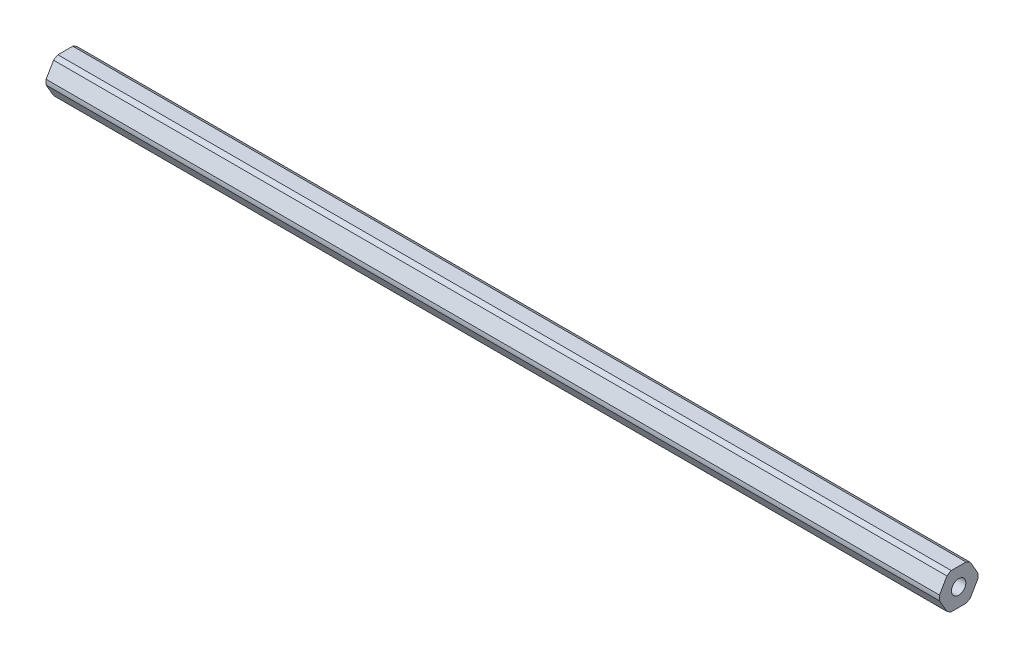
ISO-10303-21;
HEADER;
FILE_DESCRIPTION(('STEP AP214'),'2;1');
FILE_NAME('part.step','',(''),(''),'','','');
FILE_SCHEMA(('AUTOMOTIVE_DESIGN { 1 0 10303 214 1 1 1 1 }'));
ENDSEC;
DATA;
#1=APPLICATION_CONTEXT('core data for automotive mechanical design processes');
#2=APPLICATION_PROTOCOL_DEFINITION('international standard','automotive_design',2000,#1);
#3=PRODUCT_CONTEXT('',#1,'mechanical');
#4=PRODUCT('Part','Part','',(#3));
#5=PRODUCT_RELATED_PRODUCT_CATEGORY('part','',(#4));
#6=PRODUCT_DEFINITION_FORMATION('','',#4);
#7=PRODUCT_DEFINITION_CONTEXT('part definition',#1,'design');
#8=PRODUCT_DEFINITION('design','',#6,#7);
#9=PRODUCT_DEFINITION_SHAPE('','',#8);
#10=(LENGTH_UNIT() NAMED_UNIT(*) SI_UNIT(.MILLI.,.METRE.));
#11=(NAMED_UNIT(*) PLANE_ANGLE_UNIT() SI_UNIT($,.RADIAN.));
#12=(NAMED_UNIT(*) SI_UNIT($,.STERADIAN.) SOLID_ANGLE_UNIT());
#13=UNCERTAINTY_MEASURE_WITH_UNIT(LENGTH_MEASURE(1.E-05),#10,'distance_accuracy_value','');
#14=(GEOMETRIC_REPRESENTATION_CONTEXT(3) GLOBAL_UNCERTAINTY_ASSIGNED_CONTEXT((#13)) GLOBAL_UNIT_ASSIGNED_CONTEXT((#10,
#11,#12)) REPRESENTATION_CONTEXT('',''));
#15=CARTESIAN_POINT('',(0.,0.,0.));
#16=DIRECTION('',(0.,0.,1.));
#17=DIRECTION('',(1.,0.,0.));
#18=AXIS2_PLACEMENT_3D('',#15,#16,#17);
#19=CARTESIAN_POINT('',(158.75,0.,0.));
#20=DIRECTION('',(-1.,0.,0.));
#21=DIRECTION('',(0.,0.,1.));
#22=AXIS2_PLACEMENT_3D('',#19,#20,#21);
#23=CYLINDRICAL_SURFACE('',#22,6.875);
#24=CARTESIAN_POINT('',(-158.75,0.,0.));
#25=DIRECTION('',(-1.,0.,0.));
#26=DIRECTION('',(0.,0.,1.));
#27=AXIS2_PLACEMENT_3D('',#24,#25,#26);
#28=CIRCLE('',#27,6.875);
#29=CARTESIAN_POINT('',(-158.75,0.89303949420668,6.816751826331));
#30=VERTEX_POINT('',#29);
#31=CARTESIAN_POINT('',(-158.75,-0.893039494206778,6.81675182633099));
#32=VERTEX_POINT('',#31);
#33=EDGE_CURVE('E102',#30,#32,#28,.F.);
#34=ORIENTED_EDGE('',*,*,#33,.T.);
#35=DIRECTION('',(1.,0.,0.));
#36=VECTOR('',#35,1.);
#37=CARTESIAN_POINT('',(158.75,-0.893039494206775,6.81675182633099));
#38=LINE('',#37,#36);
#39=CARTESIAN_POINT('',(158.75,-0.893039494206778,6.81675182633099));
#40=VERTEX_POINT('',#39);
#41=EDGE_CURVE('E124',#32,#40,#38,.T.);
#42=ORIENTED_EDGE('',*,*,#41,.T.);
#43=CARTESIAN_POINT('',(158.75,0.,0.));
#44=DIRECTION('',(-1.,0.,0.));
#45=DIRECTION('',(0.,0.,1.));
#46=AXIS2_PLACEMENT_3D('',#43,#44,#45);
#47=CIRCLE('',#46,6.875);
#48=CARTESIAN_POINT('',(158.75,0.89303949420668,6.816751826331));
#49=VERTEX_POINT('',#48);
#50=EDGE_CURVE('E19',#40,#49,#47,.T.);
#51=ORIENTED_EDGE('',*,*,#50,.T.);
#52=DIRECTION('',(1.,0.,0.));
#53=VECTOR('',#52,1.);
#54=CARTESIAN_POINT('',(158.75,0.893039494206679,6.816751826331));
#55=LINE('',#54,#53);
#56=EDGE_CURVE('E120',#49,#30,#55,.F.);
#57=ORIENTED_EDGE('',*,*,#56,.T.);
#58=EDGE_LOOP('',(#34,#42,#51,#57));
#59=FACE_BOUND('',#58,.T.);
#60=ADVANCED_FACE('F16',(#59),#23,.T.);
#61=CARTESIAN_POINT('',(158.75,3.17499999999999,-5.49926131403116));
#62=DIRECTION('',(0.,-0.500000000000001,0.866025403784438));
#63=DIRECTION('',(0.,-0.866025403784438,-0.500000000000001));
#64=AXIS2_PLACEMENT_3D('',#61,#62,#63);
#65=PLANE('',#64);
#66=DIRECTION('',(-1.,0.,0.));
#67=VECTOR('',#66,1.);
#68=CARTESIAN_POINT('',(158.75,5.45696050579326,-4.18177080173132));
#69=LINE('',#68,#67);
#70=CARTESIAN_POINT('',(158.75,5.45696050579326,-4.18177080173131));
#71=VERTEX_POINT('',#70);
#72=CARTESIAN_POINT('',(-158.75,5.45696050579326,-4.18177080173131));
#73=VERTEX_POINT('',#72);
#74=EDGE_CURVE('E117',#71,#73,#69,.T.);
#75=ORIENTED_EDGE('',*,*,#74,.F.);
#76=DIRECTION('',(0.,0.866025403784438,0.500000000000001));
#77=VECTOR('',#76,1.);
#78=CARTESIAN_POINT('',(158.75,0.893039494206724,-6.816751826331));
#79=LINE('',#78,#77);
#80=CARTESIAN_POINT('',(158.75,0.893039494206722,-6.816751826331));
#81=VERTEX_POINT('',#80);
#82=EDGE_CURVE('E178',#81,#71,#79,.T.);
#83=ORIENTED_EDGE('',*,*,#82,.F.);
#84=DIRECTION('',(-1.,0.,0.));
#85=VECTOR('',#84,1.);
#86=CARTESIAN_POINT('',(158.75,0.893039494206723,-6.816751826331));
#87=LINE('',#86,#85);
#88=CARTESIAN_POINT('',(-158.75,0.893039494206722,-6.816751826331));
#89=VERTEX_POINT('',#88);
#90=EDGE_CURVE('E140',#89,#81,#87,.F.);
#91=ORIENTED_EDGE('',*,*,#90,.F.);
#92=DIRECTION('',(0.,0.866025403784438,0.500000000000001));
#93=VECTOR('',#92,1.);
#94=CARTESIAN_POINT('',(-158.75,0.893039494206724,-6.816751826331));
#95=LINE('',#94,#93);
#96=EDGE_CURVE('E182',#89,#73,#95,.T.);
#97=ORIENTED_EDGE('',*,*,#96,.T.);
#98=EDGE_LOOP('',(#75,#83,#91,#97));
#99=FACE_BOUND('',#98,.T.);
#100=ADVANCED_FACE('F201',(#99),#65,.F.);
#101=CARTESIAN_POINT('',(158.75,0.,0.));
#102=DIRECTION('',(-1.,0.,0.));
#103=DIRECTION('',(0.,0.,1.));
#104=AXIS2_PLACEMENT_3D('',#101,#102,#103);
#105=CYLINDRICAL_SURFACE('',#104,6.875);
#106=CARTESIAN_POINT('',(158.75,0.,0.));
#107=DIRECTION('',(-1.,0.,0.));
#108=DIRECTION('',(0.,0.,1.));
#109=AXIS2_PLACEMENT_3D('',#106,#107,#108);
#110=CIRCLE('',#109,6.875);
#111=CARTESIAN_POINT('',(158.75,6.34999999999998,-2.63498102459965));
#112=VERTEX_POINT('',#111);
#113=EDGE_CURVE('E176',#71,#112,#110,.F.);
#114=ORIENTED_EDGE('',*,*,#113,.F.);
#115=ORIENTED_EDGE('',*,*,#74,.T.);
#116=CARTESIAN_POINT('',(-158.75,0.,0.));
#117=DIRECTION('',(-1.,0.,0.));
#118=DIRECTION('',(0.,0.,1.));
#119=AXIS2_PLACEMENT_3D('',#116,#117,#118);
#120=CIRCLE('',#119,6.875);
#121=CARTESIAN_POINT('',(-158.75,6.34999999999998,-2.63498102459965));
#122=VERTEX_POINT('',#121);
#123=EDGE_CURVE('E139',#73,#122,#120,.F.);
#124=ORIENTED_EDGE('',*,*,#123,.T.);
#125=DIRECTION('',(1.,0.,0.));
#126=VECTOR('',#125,1.);
#127=CARTESIAN_POINT('',(158.75,6.34999999999998,-2.63498102459965));
#128=LINE('',#127,#126);
#129=EDGE_CURVE('E158',#122,#112,#128,.T.);
#130=ORIENTED_EDGE('',*,*,#129,.T.);
#131=EDGE_LOOP('',(#114,#115,#124,#130));
#132=FACE_BOUND('',#131,.T.);
#133=ADVANCED_FACE('F194',(#132),#105,.T.);
#134=CARTESIAN_POINT('',(158.75,6.34999999999997,0.));
#135=DIRECTION('',(0.,-1.,0.));
#136=DIRECTION('',(0.,0.,-1.));
#137=AXIS2_PLACEMENT_3D('',#134,#135,#136);
#138=PLANE('',#137);
#139=DIRECTION('',(-1.,0.,0.));
#140=VECTOR('',#139,1.);
#141=CARTESIAN_POINT('',(158.75,6.34999999999996,2.6349810245997));
#142=LINE('',#141,#140);
#143=CARTESIAN_POINT('',(158.75,6.34999999999997,2.63498102459968));
#144=VERTEX_POINT('',#143);
#145=CARTESIAN_POINT('',(-158.75,6.34999999999997,2.63498102459968));
#146=VERTEX_POINT('',#145);
#147=EDGE_CURVE('E155',#144,#146,#142,.T.);
#148=ORIENTED_EDGE('',*,*,#147,.F.);
#149=DIRECTION('',(0.,0.,-1.));
#150=VECTOR('',#149,1.);
#151=CARTESIAN_POINT('',(158.75,6.34999999999998,0.));
#152=LINE('',#151,#150);
#153=EDGE_CURVE('E175',#112,#144,#152,.F.);
#154=ORIENTED_EDGE('',*,*,#153,.F.);
#155=ORIENTED_EDGE('',*,*,#129,.F.);
#156=DIRECTION('',(0.,0.,-1.));
#157=VECTOR('',#156,1.);
#158=CARTESIAN_POINT('',(-158.75,6.34999999999998,0.));
#159=LINE('',#158,#157);
#160=EDGE_CURVE('E133',#122,#146,#159,.F.);
#161=ORIENTED_EDGE('',*,*,#160,.T.);
#162=EDGE_LOOP('',(#148,#154,#155,#161));
#163=FACE_BOUND('',#162,.T.);
#164=ADVANCED_FACE('F233',(#163),#138,.F.);
#165=CARTESIAN_POINT('',(158.75,0.,0.));
#166=DIRECTION('',(-1.,0.,0.));
#167=DIRECTION('',(0.,0.,1.));
#168=AXIS2_PLACEMENT_3D('',#165,#166,#167);
#169=CYLINDRICAL_SURFACE('',#168,6.875);
#170=CARTESIAN_POINT('',(158.75,0.,0.));
#171=DIRECTION('',(-1.,0.,0.));
#172=DIRECTION('',(0.,0.,1.));
#173=AXIS2_PLACEMENT_3D('',#170,#171,#172);
#174=CIRCLE('',#173,6.875);
#175=CARTESIAN_POINT('',(158.75,5.45696050579323,4.18177080173135));
#176=VERTEX_POINT('',#175);
#177=EDGE_CURVE('E172',#144,#176,#174,.F.);
#178=ORIENTED_EDGE('',*,*,#177,.F.);
#179=ORIENTED_EDGE('',*,*,#147,.T.);
#180=CARTESIAN_POINT('',(-158.75,0.,0.));
#181=DIRECTION('',(-1.,0.,0.));
#182=DIRECTION('',(0.,0.,1.));
#183=AXIS2_PLACEMENT_3D('',#180,#181,#182);
#184=CIRCLE('',#183,6.875);
#185=CARTESIAN_POINT('',(-158.75,5.45696050579323,4.18177080173135));
#186=VERTEX_POINT('',#185);
#187=EDGE_CURVE('E129',#146,#186,#184,.F.);
#188=ORIENTED_EDGE('',*,*,#187,.T.);
#189=DIRECTION('',(1.,0.,0.));
#190=VECTOR('',#189,1.);
#191=CARTESIAN_POINT('',(158.75,5.45696050579323,4.18177080173135));
#192=LINE('',#191,#190);
#193=EDGE_CURVE('E125',#186,#176,#192,.T.);
#194=ORIENTED_EDGE('',*,*,#193,.T.);
#195=EDGE_LOOP('',(#178,#179,#188,#194));
#196=FACE_BOUND('',#195,.T.);
#197=ADVANCED_FACE('F235',(#196),#169,.T.);
#198=CARTESIAN_POINT('',(158.75,3.17499999999995,5.49926131403118));
#199=DIRECTION('',(0.,-0.499999999999995,-0.866025403784441));
#200=DIRECTION('',(0.,0.866025403784441,-0.499999999999995));
#201=AXIS2_PLACEMENT_3D('',#198,#199,#200);
#202=PLANE('',#201);
#203=ORIENTED_EDGE('',*,*,#56,.F.);
#204=DIRECTION('',(0.,-0.866025403784441,0.499999999999995));
#205=VECTOR('',#204,1.);
#206=CARTESIAN_POINT('',(158.75,5.45696050579323,4.18177080173135));
#207=LINE('',#206,#205);
#208=EDGE_CURVE('E174',#176,#49,#207,.T.);
#209=ORIENTED_EDGE('',*,*,#208,.F.);
#210=ORIENTED_EDGE('',*,*,#193,.F.);
#211=DIRECTION('',(0.,-0.866025403784441,0.499999999999995));
#212=VECTOR('',#211,1.);
#213=CARTESIAN_POINT('',(-158.75,5.45696050579323,4.18177080173135));
#214=LINE('',#213,#212);
#215=EDGE_CURVE('E109',#186,#30,#214,.T.);
#216=ORIENTED_EDGE('',*,*,#215,.T.);
#217=EDGE_LOOP('',(#203,#209,#210,#216));
#218=FACE_BOUND('',#217,.T.);
#219=ADVANCED_FACE('F127',(#218),#202,.F.);
#220=CARTESIAN_POINT('',(158.75,-3.17500000000003,5.49926131403114));
#221=DIRECTION('',(0.,0.500000000000007,-0.866025403784435));
#222=DIRECTION('',(0.,0.866025403784435,0.500000000000007));
#223=AXIS2_PLACEMENT_3D('',#220,#221,#222);
#224=PLANE('',#223);
#225=DIRECTION('',(-1.,0.,0.));
#226=VECTOR('',#225,1.);
#227=CARTESIAN_POINT('',(158.75,-5.45696050579329,4.18177080173128));
#228=LINE('',#227,#226);
#229=CARTESIAN_POINT('',(158.75,-5.45696050579329,4.18177080173128));
#230=VERTEX_POINT('',#229);
#231=CARTESIAN_POINT('',(-158.75,-5.45696050579329,4.18177080173128));
#232=VERTEX_POINT('',#231);
#233=EDGE_CURVE('E152',#230,#232,#228,.T.);
#234=ORIENTED_EDGE('',*,*,#233,.F.);
#235=DIRECTION('',(0.,-0.866025403784435,-0.500000000000007));
#236=VECTOR('',#235,1.);
#237=CARTESIAN_POINT('',(158.75,-0.893039494206776,6.81675182633099));
#238=LINE('',#237,#236);
#239=EDGE_CURVE('E171',#40,#230,#238,.T.);
#240=ORIENTED_EDGE('',*,*,#239,.F.);
#241=ORIENTED_EDGE('',*,*,#41,.F.);
#242=DIRECTION('',(0.,-0.866025403784435,-0.500000000000007));
#243=VECTOR('',#242,1.);
#244=CARTESIAN_POINT('',(-158.75,-0.893039494206776,6.81675182633099));
#245=LINE('',#244,#243);
#246=EDGE_CURVE('E113',#32,#232,#245,.T.);
#247=ORIENTED_EDGE('',*,*,#246,.T.);
#248=EDGE_LOOP('',(#234,#240,#241,#247));
#249=FACE_BOUND('',#248,.T.);
#250=ADVANCED_FACE('F223',(#249),#224,.F.);
#251=CARTESIAN_POINT('',(158.75,0.,0.));
#252=DIRECTION('',(-1.,0.,0.));
#253=DIRECTION('',(0.,0.,1.));
#254=AXIS2_PLACEMENT_3D('',#251,#252,#253);
#255=CYLINDRICAL_SURFACE('',#254,6.875);
#256=CARTESIAN_POINT('',(158.75,0.,0.));
#257=DIRECTION('',(-1.,0.,0.));
#258=DIRECTION('',(0.,0.,1.));
#259=AXIS2_PLACEMENT_3D('',#256,#257,#258);
#260=CIRCLE('',#259,6.875);
#261=CARTESIAN_POINT('',(158.75,-6.35,2.63498102459961));
#262=VERTEX_POINT('',#261);
#263=EDGE_CURVE('E169',#230,#262,#260,.F.);
#264=ORIENTED_EDGE('',*,*,#263,.F.);
#265=ORIENTED_EDGE('',*,*,#233,.T.);
#266=CARTESIAN_POINT('',(-158.75,0.,0.));
#267=DIRECTION('',(-1.,0.,0.));
#268=DIRECTION('',(0.,0.,1.));
#269=AXIS2_PLACEMENT_3D('',#266,#267,#268);
#270=CIRCLE('',#269,6.875);
#271=CARTESIAN_POINT('',(-158.75,-6.35,2.63498102459961));
#272=VERTEX_POINT('',#271);
#273=EDGE_CURVE('E131',#232,#272,#270,.F.);
#274=ORIENTED_EDGE('',*,*,#273,.T.);
#275=DIRECTION('',(1.,0.,0.));
#276=VECTOR('',#275,1.);
#277=CARTESIAN_POINT('',(158.75,-6.35,2.63498102459961));
#278=LINE('',#277,#276);
#279=EDGE_CURVE('E149',#272,#262,#278,.T.);
#280=ORIENTED_EDGE('',*,*,#279,.T.);
#281=EDGE_LOOP('',(#264,#265,#274,#280));
#282=FACE_BOUND('',#281,.T.);
#283=ADVANCED_FACE('F219',(#282),#255,.T.);
#284=CARTESIAN_POINT('',(158.75,-6.34999999999997,0.));
#285=DIRECTION('',(0.,1.,0.));
#286=DIRECTION('',(0.,0.,1.));
#287=AXIS2_PLACEMENT_3D('',#284,#285,#286);
#288=PLANE('',#287);
#289=DIRECTION('',(-1.,0.,0.));
#290=VECTOR('',#289,1.);
#291=CARTESIAN_POINT('',(158.75,-6.34999999999994,-2.63498102459974));
#292=LINE('',#291,#290);
#293=CARTESIAN_POINT('',(158.75,-6.34999999999997,-2.63498102459968));
#294=VERTEX_POINT('',#293);
#295=CARTESIAN_POINT('',(-158.75,-6.34999999999997,-2.63498102459968));
#296=VERTEX_POINT('',#295);
#297=EDGE_CURVE('E147',#294,#296,#292,.T.);
#298=ORIENTED_EDGE('',*,*,#297,.F.);
#299=DIRECTION('',(0.,0.,-1.));
#300=VECTOR('',#299,1.);
#301=CARTESIAN_POINT('',(158.75,-6.35,0.));
#302=LINE('',#301,#300);
#303=EDGE_CURVE('E168',#262,#294,#302,.T.);
#304=ORIENTED_EDGE('',*,*,#303,.F.);
#305=ORIENTED_EDGE('',*,*,#279,.F.);
#306=DIRECTION('',(0.,0.,-1.));
#307=VECTOR('',#306,1.);
#308=CARTESIAN_POINT('',(-158.75,-6.35,0.));
#309=LINE('',#308,#307);
#310=EDGE_CURVE('E187',#272,#296,#309,.T.);
#311=ORIENTED_EDGE('',*,*,#310,.T.);
#312=EDGE_LOOP('',(#298,#304,#305,#311));
#313=FACE_BOUND('',#312,.T.);
#314=ADVANCED_FACE('F212',(#313),#288,.F.);
#315=CARTESIAN_POINT('',(158.75,0.,0.));
#316=DIRECTION('',(-1.,0.,0.));
#317=DIRECTION('',(0.,0.,1.));
#318=AXIS2_PLACEMENT_3D('',#315,#316,#317);
#319=CYLINDRICAL_SURFACE('',#318,6.875);
#320=CARTESIAN_POINT('',(158.75,0.,0.));
#321=DIRECTION('',(-1.,0.,0.));
#322=DIRECTION('',(0.,0.,1.));
#323=AXIS2_PLACEMENT_3D('',#320,#321,#322);
#324=CIRCLE('',#323,6.875);
#325=CARTESIAN_POINT('',(158.75,-5.45696050579319,-4.18177080173141));
#326=VERTEX_POINT('',#325);
#327=EDGE_CURVE('E166',#294,#326,#324,.F.);
#328=ORIENTED_EDGE('',*,*,#327,.F.);
#329=ORIENTED_EDGE('',*,*,#297,.T.);
#330=CARTESIAN_POINT('',(-158.75,0.,0.));
#331=DIRECTION('',(-1.,0.,0.));
#332=DIRECTION('',(0.,0.,1.));
#333=AXIS2_PLACEMENT_3D('',#330,#331,#332);
#334=CIRCLE('',#333,6.875);
#335=CARTESIAN_POINT('',(-158.75,-5.45696050579319,-4.18177080173141));
#336=VERTEX_POINT('',#335);
#337=EDGE_CURVE('E184',#296,#336,#334,.F.);
#338=ORIENTED_EDGE('',*,*,#337,.T.);
#339=DIRECTION('',(1.,0.,0.));
#340=VECTOR('',#339,1.);
#341=CARTESIAN_POINT('',(158.75,-5.45696050579319,-4.18177080173141));
#342=LINE('',#341,#340);
#343=EDGE_CURVE('E143',#336,#326,#342,.T.);
#344=ORIENTED_EDGE('',*,*,#343,.T.);
#345=EDGE_LOOP('',(#328,#329,#338,#344));
#346=FACE_BOUND('',#345,.T.);
#347=ADVANCED_FACE('F265',(#346),#319,.T.);
#348=CARTESIAN_POINT('',(158.75,-3.17499999999997,-5.4992613140312));
#349=DIRECTION('',(0.,0.499999999999995,0.866025403784442));
#350=DIRECTION('',(0.,-0.866025403784442,0.499999999999995));
#351=AXIS2_PLACEMENT_3D('',#348,#349,#350);
#352=PLANE('',#351);
#353=DIRECTION('',(-1.,0.,0.));
#354=VECTOR('',#353,1.);
#355=CARTESIAN_POINT('',(158.75,-0.89303949420674,-6.816751826331));
#356=LINE('',#355,#354);
#357=CARTESIAN_POINT('',(158.75,-0.893039494206741,-6.816751826331));
#358=VERTEX_POINT('',#357);
#359=CARTESIAN_POINT('',(-158.75,-0.893039494206741,-6.816751826331));
#360=VERTEX_POINT('',#359);
#361=EDGE_CURVE('E142',#358,#360,#356,.T.);
#362=ORIENTED_EDGE('',*,*,#361,.F.);
#363=DIRECTION('',(0.,0.866025403784442,-0.499999999999995));
#364=VECTOR('',#363,1.);
#365=CARTESIAN_POINT('',(158.75,-5.45696050579319,-4.18177080173141));
#366=LINE('',#365,#364);
#367=EDGE_CURVE('E34',#326,#358,#366,.T.);
#368=ORIENTED_EDGE('',*,*,#367,.F.);
#369=ORIENTED_EDGE('',*,*,#343,.F.);
#370=DIRECTION('',(0.,0.866025403784442,-0.499999999999995));
#371=VECTOR('',#370,1.);
#372=CARTESIAN_POINT('',(-158.75,-5.45696050579319,-4.18177080173141));
#373=LINE('',#372,#371);
#374=EDGE_CURVE('E183',#336,#360,#373,.T.);
#375=ORIENTED_EDGE('',*,*,#374,.T.);
#376=EDGE_LOOP('',(#362,#368,#369,#375));
#377=FACE_BOUND('',#376,.T.);
#378=ADVANCED_FACE('F261',(#377),#352,.F.);
#379=CARTESIAN_POINT('',(158.75,0.,0.));
#380=DIRECTION('',(-1.,0.,0.));
#381=DIRECTION('',(0.,0.,1.));
#382=AXIS2_PLACEMENT_3D('',#379,#380,#381);
#383=CYLINDRICAL_SURFACE('',#382,6.875);
#384=CARTESIAN_POINT('',(158.75,0.,0.));
#385=DIRECTION('',(-1.,0.,0.));
#386=DIRECTION('',(0.,0.,1.));
#387=AXIS2_PLACEMENT_3D('',#384,#385,#386);
#388=CIRCLE('',#387,6.875);
#389=EDGE_CURVE('E164',#358,#81,#388,.F.);
#390=ORIENTED_EDGE('',*,*,#389,.F.);
#391=ORIENTED_EDGE('',*,*,#361,.T.);
#392=CARTESIAN_POINT('',(-158.75,0.,0.));
#393=DIRECTION('',(-1.,0.,0.));
#394=DIRECTION('',(0.,0.,1.));
#395=AXIS2_PLACEMENT_3D('',#392,#393,#394);
#396=CIRCLE('',#395,6.875);
#397=EDGE_CURVE('E179',#360,#89,#396,.F.);
#398=ORIENTED_EDGE('',*,*,#397,.T.);
#399=ORIENTED_EDGE('',*,*,#90,.T.);
#400=EDGE_LOOP('',(#390,#391,#398,#399));
#401=FACE_BOUND('',#400,.T.);
#402=ADVANCED_FACE('F258',(#401),#383,.T.);
#403=CARTESIAN_POINT('',(-158.75,0.,0.));
#404=DIRECTION('',(1.,0.,0.));
#405=DIRECTION('',(0.,0.,-1.));
#406=AXIS2_PLACEMENT_3D('',#403,#404,#405);
#407=PLANE('',#406);
#408=ORIENTED_EDGE('',*,*,#397,.F.);
#409=ORIENTED_EDGE('',*,*,#374,.F.);
#410=ORIENTED_EDGE('',*,*,#337,.F.);
#411=ORIENTED_EDGE('',*,*,#310,.F.);
#412=ORIENTED_EDGE('',*,*,#273,.F.);
#413=ORIENTED_EDGE('',*,*,#246,.F.);
#414=ORIENTED_EDGE('',*,*,#33,.F.);
#415=ORIENTED_EDGE('',*,*,#215,.F.);
#416=ORIENTED_EDGE('',*,*,#187,.F.);
#417=ORIENTED_EDGE('',*,*,#160,.F.);
#418=ORIENTED_EDGE('',*,*,#123,.F.);
#419=ORIENTED_EDGE('',*,*,#96,.F.);
#420=EDGE_LOOP('',(#408,#409,#410,#411,#412,#413,#414,#415,#416,#417,#418,#419));
#421=FACE_BOUND('',#420,.T.);
#422=CARTESIAN_POINT('',(-158.75,0.,0.));
#423=DIRECTION('',(-1.,0.,0.));
#424=DIRECTION('',(0.,0.,1.));
#425=AXIS2_PLACEMENT_3D('',#422,#423,#424);
#426=CIRCLE('',#425,2.5527);
#427=CARTESIAN_POINT('',(-158.75,0.,2.5527));
#428=VERTEX_POINT('',#427);
#429=EDGE_CURVE('E25',#428,#428,#426,.F.);
#430=ORIENTED_EDGE('',*,*,#429,.T.);
#431=EDGE_LOOP('',(#430));
#432=FACE_BOUND('',#431,.T.);
#433=ADVANCED_FACE('F105',(#421,#432),#407,.F.);
#434=CARTESIAN_POINT('',(158.75,0.,0.));
#435=DIRECTION('',(1.,0.,0.));
#436=DIRECTION('',(0.,0.,-1.));
#437=AXIS2_PLACEMENT_3D('',#434,#435,#436);
#438=PLANE('',#437);
#439=ORIENTED_EDGE('',*,*,#367,.T.);
#440=ORIENTED_EDGE('',*,*,#389,.T.);
#441=ORIENTED_EDGE('',*,*,#82,.T.);
#442=ORIENTED_EDGE('',*,*,#113,.T.);
#443=ORIENTED_EDGE('',*,*,#153,.T.);
#444=ORIENTED_EDGE('',*,*,#177,.T.);
#445=ORIENTED_EDGE('',*,*,#208,.T.);
#446=ORIENTED_EDGE('',*,*,#50,.F.);
#447=ORIENTED_EDGE('',*,*,#239,.T.);
#448=ORIENTED_EDGE('',*,*,#263,.T.);
#449=ORIENTED_EDGE('',*,*,#303,.T.);
#450=ORIENTED_EDGE('',*,*,#327,.T.);
#451=EDGE_LOOP('',(#439,#440,#441,#442,#443,#444,#445,#446,#447,#448,#449,#450));
#452=FACE_BOUND('',#451,.T.);
#453=CARTESIAN_POINT('',(158.75,0.,0.));
#454=DIRECTION('',(-1.,0.,0.));
#455=DIRECTION('',(0.,0.,1.));
#456=AXIS2_PLACEMENT_3D('',#453,#454,#455);
#457=CIRCLE('',#456,2.5527);
#458=CARTESIAN_POINT('',(158.75,0.,2.5527));
#459=VERTEX_POINT('',#458);
#460=EDGE_CURVE('E11',#459,#459,#457,.T.);
#461=ORIENTED_EDGE('',*,*,#460,.T.);
#462=EDGE_LOOP('',(#461));
#463=FACE_BOUND('',#462,.T.);
#464=ADVANCED_FACE('F229',(#452,#463),#438,.T.);
#465=CARTESIAN_POINT('',(158.75,0.,0.));
#466=DIRECTION('',(-1.,0.,0.));
#467=DIRECTION('',(0.,0.,1.));
#468=AXIS2_PLACEMENT_3D('',#465,#466,#467);
#469=CYLINDRICAL_SURFACE('',#468,2.5527);
#470=ORIENTED_EDGE('',*,*,#429,.F.);
#471=EDGE_LOOP('',(#470));
#472=FACE_BOUND('',#471,.T.);
#473=ORIENTED_EDGE('',*,*,#460,.F.);
#474=EDGE_LOOP('',(#473));
#475=FACE_BOUND('',#474,.T.);
#476=ADVANCED_FACE('F245',(#472,#475),#469,.F.);
#477=CLOSED_SHELL('',(#60,#100,#133,#164,#197,#219,#250,#283,#314,#347,#378,#402,#433,#464,#476));
#478=MANIFOLD_SOLID_BREP('B1',#477);
#479=ADVANCED_BREP_SHAPE_REPRESENTATION('',(#18,#478),#14);
#480=SHAPE_DEFINITION_REPRESENTATION(#9,#479);
ENDSEC;
END-ISO-10303-21;
